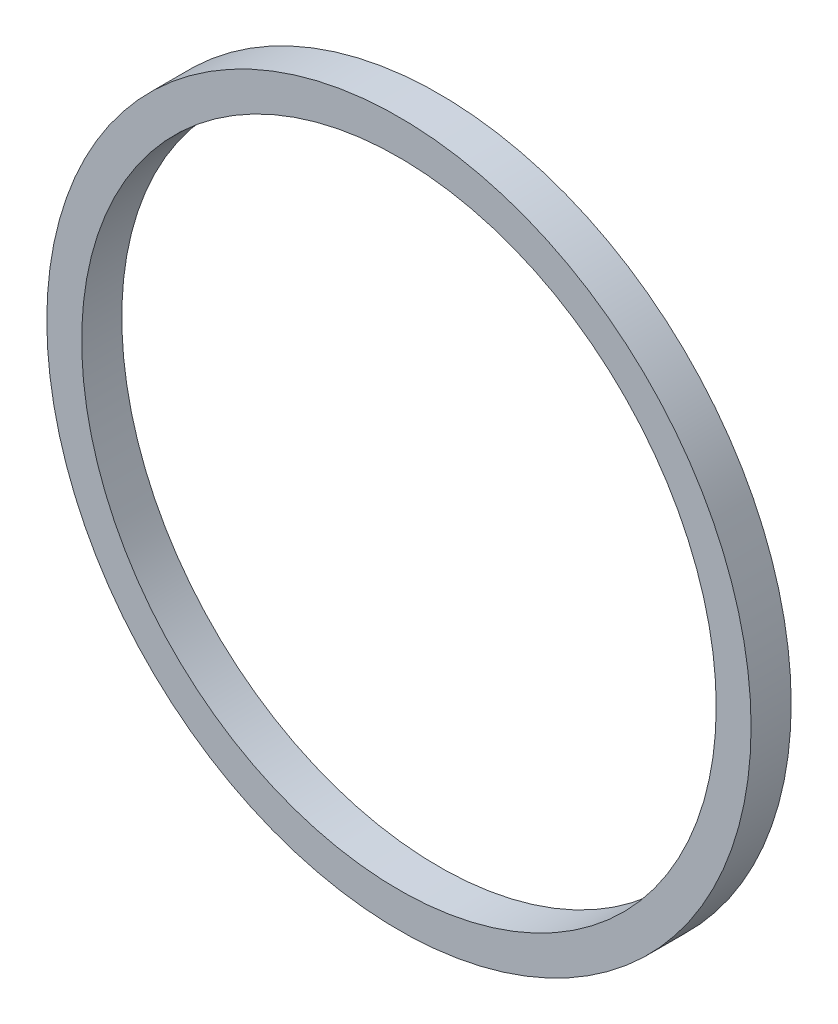
ISO-10303-21;
HEADER;
FILE_DESCRIPTION(('STEP AP214'),'2;1');
FILE_NAME('part.step','',(''),(''),'','','');
FILE_SCHEMA(('AUTOMOTIVE_DESIGN { 1 0 10303 214 1 1 1 1 }'));
ENDSEC;
DATA;
#1=APPLICATION_CONTEXT('core data for automotive mechanical design processes');
#2=APPLICATION_PROTOCOL_DEFINITION('international standard','automotive_design',2000,#1);
#3=PRODUCT_CONTEXT('',#1,'mechanical');
#4=PRODUCT('Part','Part','',(#3));
#5=PRODUCT_RELATED_PRODUCT_CATEGORY('part','',(#4));
#6=PRODUCT_DEFINITION_FORMATION('','',#4);
#7=PRODUCT_DEFINITION_CONTEXT('part definition',#1,'design');
#8=PRODUCT_DEFINITION('design','',#6,#7);
#9=PRODUCT_DEFINITION_SHAPE('','',#8);
#10=(LENGTH_UNIT() NAMED_UNIT(*) SI_UNIT(.MILLI.,.METRE.));
#11=(NAMED_UNIT(*) PLANE_ANGLE_UNIT() SI_UNIT($,.RADIAN.));
#12=(NAMED_UNIT(*) SI_UNIT($,.STERADIAN.) SOLID_ANGLE_UNIT());
#13=UNCERTAINTY_MEASURE_WITH_UNIT(LENGTH_MEASURE(1.E-05),#10,'distance_accuracy_value','');
#14=(GEOMETRIC_REPRESENTATION_CONTEXT(3) GLOBAL_UNCERTAINTY_ASSIGNED_CONTEXT((#13)) GLOBAL_UNIT_ASSIGNED_CONTEXT((#10,
#11,#12)) REPRESENTATION_CONTEXT('',''));
#15=CARTESIAN_POINT('',(0.,0.,0.));
#16=DIRECTION('',(0.,0.,1.));
#17=DIRECTION('',(1.,0.,0.));
#18=AXIS2_PLACEMENT_3D('',#15,#16,#17);
#19=CARTESIAN_POINT('',(0.,0.,1.15));
#20=DIRECTION('',(0.,0.,-1.));
#21=DIRECTION('',(-1.,0.,0.));
#22=AXIS2_PLACEMENT_3D('',#19,#20,#21);
#23=CYLINDRICAL_SURFACE('',#22,10.1);
#24=CARTESIAN_POINT('',(0.,0.,1.15));
#25=DIRECTION('',(0.,0.,1.));
#26=DIRECTION('',(1.,0.,0.));
#27=AXIS2_PLACEMENT_3D('',#24,#25,#26);
#28=CIRCLE('',#27,10.1);
#29=CARTESIAN_POINT('',(10.1,0.,1.15));
#30=VERTEX_POINT('',#29);
#31=EDGE_CURVE('E10',#30,#30,#28,.T.);
#32=ORIENTED_EDGE('',*,*,#31,.F.);
#33=EDGE_LOOP('',(#32));
#34=FACE_BOUND('',#33,.T.);
#35=CARTESIAN_POINT('',(0.,0.,0.));
#36=DIRECTION('',(0.,0.,1.));
#37=DIRECTION('',(1.,0.,0.));
#38=AXIS2_PLACEMENT_3D('',#35,#36,#37);
#39=CIRCLE('',#38,10.1);
#40=CARTESIAN_POINT('',(10.1,0.,0.));
#41=VERTEX_POINT('',#40);
#42=EDGE_CURVE('E34',#41,#41,#39,.T.);
#43=ORIENTED_EDGE('',*,*,#42,.T.);
#44=EDGE_LOOP('',(#43));
#45=FACE_BOUND('',#44,.T.);
#46=ADVANCED_FACE('F31',(#34,#45),#23,.T.);
#47=CARTESIAN_POINT('',(0.,0.,1.15));
#48=DIRECTION('',(0.,0.,1.));
#49=DIRECTION('',(1.,0.,0.));
#50=AXIS2_PLACEMENT_3D('',#47,#48,#49);
#51=PLANE('',#50);
#52=CARTESIAN_POINT('',(0.,0.,1.15));
#53=DIRECTION('',(0.,0.,1.));
#54=DIRECTION('',(1.,0.,0.));
#55=AXIS2_PLACEMENT_3D('',#52,#53,#54);
#56=CIRCLE('',#55,9.1);
#57=CARTESIAN_POINT('',(9.1,0.,1.15));
#58=VERTEX_POINT('',#57);
#59=EDGE_CURVE('E43',#58,#58,#56,.T.);
#60=ORIENTED_EDGE('',*,*,#59,.F.);
#61=EDGE_LOOP('',(#60));
#62=FACE_BOUND('',#61,.T.);
#63=ORIENTED_EDGE('',*,*,#31,.T.);
#64=EDGE_LOOP('',(#63));
#65=FACE_BOUND('',#64,.T.);
#66=ADVANCED_FACE('F58',(#62,#65),#51,.T.);
#67=CARTESIAN_POINT('',(0.,0.,0.));
#68=DIRECTION('',(0.,0.,1.));
#69=DIRECTION('',(1.,0.,0.));
#70=AXIS2_PLACEMENT_3D('',#67,#68,#69);
#71=PLANE('',#70);
#72=CARTESIAN_POINT('',(0.,0.,0.));
#73=DIRECTION('',(0.,0.,1.));
#74=DIRECTION('',(1.,0.,0.));
#75=AXIS2_PLACEMENT_3D('',#72,#73,#74);
#76=CIRCLE('',#75,9.1);
#77=CARTESIAN_POINT('',(9.1,0.,0.));
#78=VERTEX_POINT('',#77);
#79=EDGE_CURVE('E41',#78,#78,#76,.T.);
#80=ORIENTED_EDGE('',*,*,#79,.T.);
#81=EDGE_LOOP('',(#80));
#82=FACE_BOUND('',#81,.T.);
#83=ORIENTED_EDGE('',*,*,#42,.F.);
#84=EDGE_LOOP('',(#83));
#85=FACE_BOUND('',#84,.T.);
#86=ADVANCED_FACE('F49',(#82,#85),#71,.F.);
#87=CARTESIAN_POINT('',(0.,0.,0.));
#88=DIRECTION('',(0.,0.,1.));
#89=DIRECTION('',(1.,0.,0.));
#90=AXIS2_PLACEMENT_3D('',#87,#88,#89);
#91=CYLINDRICAL_SURFACE('',#90,9.1);
#92=ORIENTED_EDGE('',*,*,#79,.F.);
#93=EDGE_LOOP('',(#92));
#94=FACE_BOUND('',#93,.T.);
#95=ORIENTED_EDGE('',*,*,#59,.T.);
#96=EDGE_LOOP('',(#95));
#97=FACE_BOUND('',#96,.T.);
#98=ADVANCED_FACE('F52',(#94,#97),#91,.F.);
#99=CLOSED_SHELL('',(#46,#66,#86,#98));
#100=MANIFOLD_SOLID_BREP('B2',#99);
#101=ADVANCED_BREP_SHAPE_REPRESENTATION('',(#18,#100),#14);
#102=SHAPE_DEFINITION_REPRESENTATION(#9,#101);
ENDSEC;
END-ISO-10303-21;
